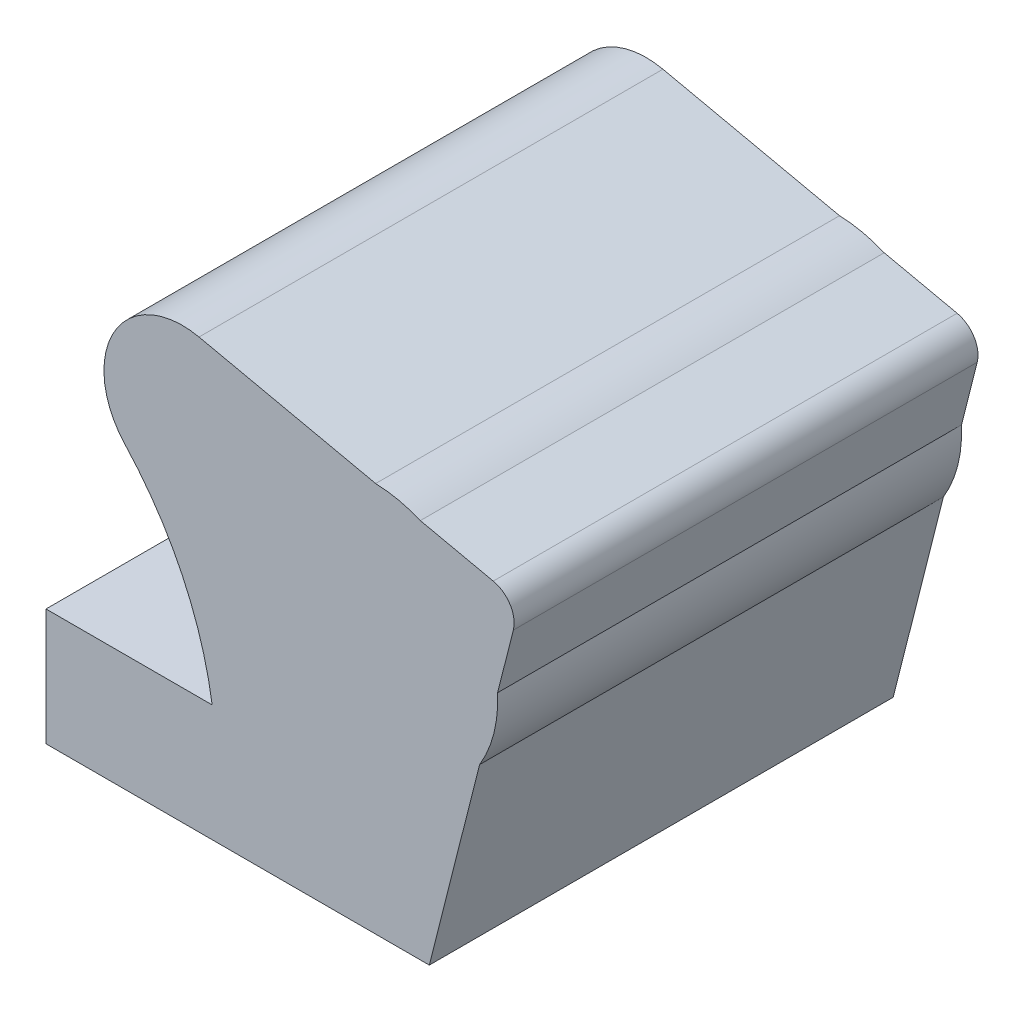
ISO-10303-21;
HEADER;
FILE_DESCRIPTION(('STEP AP214'),'2;1');
FILE_NAME('part.step','',(''),(''),'','','');
FILE_SCHEMA(('AUTOMOTIVE_DESIGN { 1 0 10303 214 1 1 1 1 }'));
ENDSEC;
DATA;
#1=APPLICATION_CONTEXT('core data for automotive mechanical design processes');
#2=APPLICATION_PROTOCOL_DEFINITION('international standard','automotive_design',2000,#1);
#3=PRODUCT_CONTEXT('',#1,'mechanical');
#4=PRODUCT('Part','Part','',(#3));
#5=PRODUCT_RELATED_PRODUCT_CATEGORY('part','',(#4));
#6=PRODUCT_DEFINITION_FORMATION('','',#4);
#7=PRODUCT_DEFINITION_CONTEXT('part definition',#1,'design');
#8=PRODUCT_DEFINITION('design','',#6,#7);
#9=PRODUCT_DEFINITION_SHAPE('','',#8);
#10=(LENGTH_UNIT() NAMED_UNIT(*) SI_UNIT(.MILLI.,.METRE.));
#11=(NAMED_UNIT(*) PLANE_ANGLE_UNIT() SI_UNIT($,.RADIAN.));
#12=(NAMED_UNIT(*) SI_UNIT($,.STERADIAN.) SOLID_ANGLE_UNIT());
#13=UNCERTAINTY_MEASURE_WITH_UNIT(LENGTH_MEASURE(1.E-05),#10,'distance_accuracy_value','');
#14=(GEOMETRIC_REPRESENTATION_CONTEXT(3) GLOBAL_UNCERTAINTY_ASSIGNED_CONTEXT((#13)) GLOBAL_UNIT_ASSIGNED_CONTEXT((#10,
#11,#12)) REPRESENTATION_CONTEXT('',''));
#15=CARTESIAN_POINT('',(0.,0.,0.));
#16=DIRECTION('',(0.,0.,1.));
#17=DIRECTION('',(1.,0.,0.));
#18=AXIS2_PLACEMENT_3D('',#15,#16,#17);
#19=CARTESIAN_POINT('',(18.9674720334947,63.3442468776892,50.));
#20=DIRECTION('',(0.,0.,-1.));
#21=DIRECTION('',(-1.,0.,0.));
#22=AXIS2_PLACEMENT_3D('',#19,#20,#21);
#23=CYLINDRICAL_SURFACE('',#22,74.3600000000827);
#24=CARTESIAN_POINT('',(18.9674720334947,63.3442468776892,-50.));
#25=DIRECTION('',(0.,0.,1.));
#26=DIRECTION('',(1.,0.,0.));
#27=AXIS2_PLACEMENT_3D('',#24,#25,#26);
#28=CIRCLE('',#27,74.3600000000827);
#29=CARTESIAN_POINT('',(92.4961728839557,74.4320668282345,-50.));
#30=VERTEX_POINT('',#29);
#31=CARTESIAN_POINT('',(73.6390675428682,113.746888122685,-50.));
#32=VERTEX_POINT('',#31);
#33=EDGE_CURVE('E181',#30,#32,#28,.T.);
#34=ORIENTED_EDGE('',*,*,#33,.F.);
#35=DIRECTION('',(0.,0.,-1.));
#36=VECTOR('',#35,1.);
#37=CARTESIAN_POINT('',(92.4961728839557,74.4320668282345,50.));
#38=LINE('',#37,#36);
#39=CARTESIAN_POINT('',(92.4961728839557,74.4320668282345,50.));
#40=VERTEX_POINT('',#39);
#41=EDGE_CURVE('E177',#40,#30,#38,.T.);
#42=ORIENTED_EDGE('',*,*,#41,.F.);
#43=CARTESIAN_POINT('',(18.9674720334947,63.3442468776892,50.));
#44=DIRECTION('',(0.,0.,1.));
#45=DIRECTION('',(1.,0.,0.));
#46=AXIS2_PLACEMENT_3D('',#43,#44,#45);
#47=CIRCLE('',#46,74.3600000000827);
#48=CARTESIAN_POINT('',(73.6390675428682,113.746888122685,50.));
#49=VERTEX_POINT('',#48);
#50=EDGE_CURVE('E179',#40,#49,#47,.T.);
#51=ORIENTED_EDGE('',*,*,#50,.T.);
#52=DIRECTION('',(0.,0.,-1.));
#53=VECTOR('',#52,1.);
#54=CARTESIAN_POINT('',(73.6390675428682,113.746888122685,50.));
#55=LINE('',#54,#53);
#56=EDGE_CURVE('E186',#49,#32,#55,.T.);
#57=ORIENTED_EDGE('',*,*,#56,.T.);
#58=EDGE_LOOP('',(#34,#42,#51,#57));
#59=FACE_BOUND('',#58,.T.);
#60=ADVANCED_FACE('F89',(#59),#23,.F.);
#61=CARTESIAN_POINT('',(86.0571495833515,125.195321778332,50.));
#62=DIRECTION('',(0.,0.,-1.));
#63=DIRECTION('',(-1.,0.,0.));
#64=AXIS2_PLACEMENT_3D('',#61,#62,#63);
#65=CYLINDRICAL_SURFACE('',#64,16.890097534707);
#66=CARTESIAN_POINT('',(86.0571495833515,125.195321778332,-50.));
#67=DIRECTION('',(0.,0.,-1.));
#68=DIRECTION('',(-1.,0.,0.));
#69=AXIS2_PLACEMENT_3D('',#66,#67,#68);
#70=CIRCLE('',#69,16.890097534707);
#71=CARTESIAN_POINT('',(89.6610000000004,141.696462857249,-50.));
#72=VERTEX_POINT('',#71);
#73=EDGE_CURVE('E223',#32,#72,#70,.T.);
#74=ORIENTED_EDGE('',*,*,#73,.F.);
#75=ORIENTED_EDGE('',*,*,#56,.F.);
#76=CARTESIAN_POINT('',(86.0571495833515,125.195321778332,50.));
#77=DIRECTION('',(0.,0.,-1.));
#78=DIRECTION('',(-1.,0.,0.));
#79=AXIS2_PLACEMENT_3D('',#76,#77,#78);
#80=CIRCLE('',#79,16.890097534707);
#81=CARTESIAN_POINT('',(89.6610000000004,141.696462857249,50.));
#82=VERTEX_POINT('',#81);
#83=EDGE_CURVE('E196',#49,#82,#80,.T.);
#84=ORIENTED_EDGE('',*,*,#83,.T.);
#85=DIRECTION('',(0.,0.,-1.));
#86=VECTOR('',#85,1.);
#87=CARTESIAN_POINT('',(89.6610000000004,141.696462857249,50.));
#88=LINE('',#87,#86);
#89=EDGE_CURVE('E248',#82,#72,#88,.T.);
#90=ORIENTED_EDGE('',*,*,#89,.T.);
#91=EDGE_LOOP('',(#74,#75,#84,#90));
#92=FACE_BOUND('',#91,.T.);
#93=ADVANCED_FACE('F294',(#92),#65,.T.);
#94=CARTESIAN_POINT('',(153.08647989012,127.844333417534,50.));
#95=DIRECTION('',(-0.213370610160388,-0.976971331575182,0.));
#96=DIRECTION('',(0.976971331575182,-0.213370610160388,0.));
#97=AXIS2_PLACEMENT_3D('',#94,#95,#96);
#98=PLANE('',#97);
#99=DIRECTION('',(0.,0.,-1.));
#100=VECTOR('',#99,1.);
#101=CARTESIAN_POINT('',(127.735239934011,133.381046075249,50.));
#102=LINE('',#101,#100);
#103=CARTESIAN_POINT('',(127.735239934011,133.381046075249,-50.));
#104=VERTEX_POINT('',#103);
#105=CARTESIAN_POINT('',(127.735239934011,133.381046075249,50.));
#106=VERTEX_POINT('',#105);
#107=EDGE_CURVE('E260',#104,#106,#102,.F.);
#108=ORIENTED_EDGE('',*,*,#107,.F.);
#109=DIRECTION('',(-0.976971331575182,0.213370610160388,0.));
#110=VECTOR('',#109,1.);
#111=CARTESIAN_POINT('',(153.08647989012,127.844333417534,-50.));
#112=LINE('',#111,#110);
#113=EDGE_CURVE('E226',#104,#72,#112,.T.);
#114=ORIENTED_EDGE('',*,*,#113,.T.);
#115=ORIENTED_EDGE('',*,*,#89,.F.);
#116=DIRECTION('',(-0.976971331575182,0.213370610160388,0.));
#117=VECTOR('',#116,1.);
#118=CARTESIAN_POINT('',(153.08647989012,127.844333417534,50.));
#119=LINE('',#118,#117);
#120=EDGE_CURVE('E207',#106,#82,#119,.T.);
#121=ORIENTED_EDGE('',*,*,#120,.F.);
#122=EDGE_LOOP('',(#108,#114,#115,#121));
#123=FACE_BOUND('',#122,.T.);
#124=ADVANCED_FACE('F290',(#123),#98,.F.);
#125=CARTESIAN_POINT('',(126.841000000001,106.1775,50.));
#126=DIRECTION('',(0.,0.,-1.));
#127=DIRECTION('',(-1.,0.,0.));
#128=AXIS2_PLACEMENT_3D('',#125,#126,#127);
#129=CYLINDRICAL_SURFACE('',#128,27.2182399160523);
#130=CARTESIAN_POINT('',(126.841000000001,106.1775,-50.));
#131=DIRECTION('',(0.,0.,1.));
#132=DIRECTION('',(1.,0.,0.));
#133=AXIS2_PLACEMENT_3D('',#130,#131,#132);
#134=CIRCLE('',#133,27.2182399160523);
#135=CARTESIAN_POINT('',(137.369721748575,131.27687454338,-50.));
#136=VERTEX_POINT('',#135);
#137=EDGE_CURVE('E255',#136,#104,#134,.T.);
#138=ORIENTED_EDGE('',*,*,#137,.T.);
#139=ORIENTED_EDGE('',*,*,#107,.T.);
#140=CARTESIAN_POINT('',(126.841000000001,106.1775,50.));
#141=DIRECTION('',(0.,0.,1.));
#142=DIRECTION('',(1.,0.,0.));
#143=AXIS2_PLACEMENT_3D('',#140,#141,#142);
#144=CIRCLE('',#143,27.2182399160523);
#145=CARTESIAN_POINT('',(137.369721748575,131.27687454338,50.));
#146=VERTEX_POINT('',#145);
#147=EDGE_CURVE('E221',#146,#106,#144,.T.);
#148=ORIENTED_EDGE('',*,*,#147,.F.);
#149=DIRECTION('',(0.,0.,-1.));
#150=VECTOR('',#149,1.);
#151=CARTESIAN_POINT('',(137.369721748575,131.27687454338,50.));
#152=LINE('',#151,#150);
#153=EDGE_CURVE('E238',#146,#136,#152,.T.);
#154=ORIENTED_EDGE('',*,*,#153,.T.);
#155=EDGE_LOOP('',(#138,#139,#148,#154));
#156=FACE_BOUND('',#155,.T.);
#157=ADVANCED_FACE('F287',(#156),#129,.T.);
#158=ORIENTED_EDGE('',*,*,#153,.F.);
#159=CARTESIAN_POINT('',(153.08647989012,127.844333417534,50.));
#160=VERTEX_POINT('',#159);
#161=EDGE_CURVE('E208',#160,#146,#119,.T.);
#162=ORIENTED_EDGE('',*,*,#161,.F.);
#163=DIRECTION('',(0.,0.,-1.));
#164=VECTOR('',#163,1.);
#165=CARTESIAN_POINT('',(153.08647989012,127.844333417534,50.));
#166=LINE('',#165,#164);
#167=CARTESIAN_POINT('',(153.08647989012,127.844333417534,-50.));
#168=VERTEX_POINT('',#167);
#169=EDGE_CURVE('E245',#160,#168,#166,.T.);
#170=ORIENTED_EDGE('',*,*,#169,.T.);
#171=EDGE_CURVE('E227',#168,#136,#112,.T.);
#172=ORIENTED_EDGE('',*,*,#171,.T.);
#173=EDGE_LOOP('',(#158,#162,#170,#172));
#174=FACE_BOUND('',#173,.T.);
#175=ADVANCED_FACE('F282',(#174),#98,.F.);
#176=CARTESIAN_POINT('',(151.866000000002,122.256057400924,50.));
#177=DIRECTION('',(0.,0.,-1.));
#178=DIRECTION('',(-1.,0.,0.));
#179=AXIS2_PLACEMENT_3D('',#176,#177,#178);
#180=CYLINDRICAL_SURFACE('',#179,5.72000000000003);
#181=CARTESIAN_POINT('',(151.866000000002,122.256057400924,-50.));
#182=DIRECTION('',(0.,0.,1.));
#183=DIRECTION('',(1.,0.,0.));
#184=AXIS2_PLACEMENT_3D('',#181,#182,#183);
#185=CIRCLE('',#184,5.72000000000003);
#186=CARTESIAN_POINT('',(157.411382405651,120.85351186686,-50.));
#187=VERTEX_POINT('',#186);
#188=EDGE_CURVE('E230',#187,#168,#185,.T.);
#189=ORIENTED_EDGE('',*,*,#188,.T.);
#190=ORIENTED_EDGE('',*,*,#169,.F.);
#191=CARTESIAN_POINT('',(151.866000000002,122.256057400924,50.));
#192=DIRECTION('',(0.,0.,1.));
#193=DIRECTION('',(1.,0.,0.));
#194=AXIS2_PLACEMENT_3D('',#191,#192,#193);
#195=CIRCLE('',#194,5.72000000000003);
#196=CARTESIAN_POINT('',(157.411382405651,120.85351186686,50.));
#197=VERTEX_POINT('',#196);
#198=EDGE_CURVE('E211',#197,#160,#195,.T.);
#199=ORIENTED_EDGE('',*,*,#198,.F.);
#200=DIRECTION('',(0.,0.,-1.));
#201=VECTOR('',#200,1.);
#202=CARTESIAN_POINT('',(157.411382405651,120.85351186686,50.));
#203=LINE('',#202,#201);
#204=EDGE_CURVE('E242',#197,#187,#203,.T.);
#205=ORIENTED_EDGE('',*,*,#204,.T.);
#206=EDGE_LOOP('',(#189,#190,#199,#205));
#207=FACE_BOUND('',#206,.T.);
#208=ADVANCED_FACE('F276',(#207),#180,.T.);
#209=CARTESIAN_POINT('',(139.303205184739,49.2574282315053,50.));
#210=DIRECTION('',(-0.969472448539981,0.24520026819295,0.));
#211=DIRECTION('',(-0.24520026819295,-0.969472448539981,0.));
#212=AXIS2_PLACEMENT_3D('',#209,#210,#211);
#213=PLANE('',#212);
#214=DIRECTION('',(0.,0.,-1.));
#215=VECTOR('',#214,1.);
#216=CARTESIAN_POINT('',(154.028196984966,107.477078481087,50.));
#217=LINE('',#216,#215);
#218=CARTESIAN_POINT('',(154.028196984966,107.477078481087,-50.));
#219=VERTEX_POINT('',#218);
#220=CARTESIAN_POINT('',(154.028196984966,107.477078481087,50.));
#221=VERTEX_POINT('',#220);
#222=EDGE_CURVE('E97',#219,#221,#217,.F.);
#223=ORIENTED_EDGE('',*,*,#222,.F.);
#224=DIRECTION('',(0.24520026819295,0.96947244853998,0.));
#225=VECTOR('',#224,1.);
#226=CARTESIAN_POINT('',(139.303205184739,49.2574282315053,-50.));
#227=LINE('',#226,#225);
#228=EDGE_CURVE('E232',#219,#187,#227,.T.);
#229=ORIENTED_EDGE('',*,*,#228,.T.);
#230=ORIENTED_EDGE('',*,*,#204,.F.);
#231=DIRECTION('',(0.24520026819295,0.96947244853998,0.));
#232=VECTOR('',#231,1.);
#233=CARTESIAN_POINT('',(139.303205184739,49.2574282315053,50.));
#234=LINE('',#233,#232);
#235=EDGE_CURVE('E213',#221,#197,#234,.T.);
#236=ORIENTED_EDGE('',*,*,#235,.F.);
#237=EDGE_LOOP('',(#223,#229,#230,#236));
#238=FACE_BOUND('',#237,.T.);
#239=ADVANCED_FACE('F271',(#238),#213,.F.);
#240=CARTESIAN_POINT('',(150.141177621161,92.1085872150625,-50.));
#241=VERTEX_POINT('',#240);
#242=EDGE_CURVE('E256',#241,#219,#134,.T.);
#243=ORIENTED_EDGE('',*,*,#242,.T.);
#244=ORIENTED_EDGE('',*,*,#222,.T.);
#245=CARTESIAN_POINT('',(150.141177621161,92.1085872150625,50.));
#246=VERTEX_POINT('',#245);
#247=EDGE_CURVE('E252',#246,#221,#144,.T.);
#248=ORIENTED_EDGE('',*,*,#247,.F.);
#249=DIRECTION('',(0.,0.,-1.));
#250=VECTOR('',#249,1.);
#251=CARTESIAN_POINT('',(150.141177621161,92.1085872150625,50.));
#252=LINE('',#251,#250);
#253=EDGE_CURVE('E262',#246,#241,#252,.T.);
#254=ORIENTED_EDGE('',*,*,#253,.T.);
#255=EDGE_LOOP('',(#243,#244,#248,#254));
#256=FACE_BOUND('',#255,.T.);
#257=ADVANCED_FACE('F91',(#256),#129,.T.);
#258=CARTESIAN_POINT('',(56.6720409296533,74.4320668282345,50.));
#259=DIRECTION('',(0.,1.,0.));
#260=DIRECTION('',(0.,0.,1.));
#261=AXIS2_PLACEMENT_3D('',#258,#259,#260);
#262=PLANE('',#261);
#263=DIRECTION('',(1.,0.,0.));
#264=VECTOR('',#263,1.);
#265=CARTESIAN_POINT('',(56.6720409296533,74.4320668282345,-50.));
#266=LINE('',#265,#264);
#267=CARTESIAN_POINT('',(56.6720409296533,74.4320668282345,-50.));
#268=VERTEX_POINT('',#267);
#269=EDGE_CURVE('E219',#268,#30,#266,.T.);
#270=ORIENTED_EDGE('',*,*,#269,.F.);
#271=DIRECTION('',(0.,0.,-1.));
#272=VECTOR('',#271,1.);
#273=CARTESIAN_POINT('',(56.6720409296533,74.4320668282345,50.));
#274=LINE('',#273,#272);
#275=CARTESIAN_POINT('',(56.6720409296533,74.4320668282345,50.));
#276=VERTEX_POINT('',#275);
#277=EDGE_CURVE('E201',#276,#268,#274,.T.);
#278=ORIENTED_EDGE('',*,*,#277,.F.);
#279=DIRECTION('',(1.,0.,0.));
#280=VECTOR('',#279,1.);
#281=CARTESIAN_POINT('',(56.6720409296533,74.4320668282345,50.));
#282=LINE('',#281,#280);
#283=EDGE_CURVE('E194',#276,#40,#282,.T.);
#284=ORIENTED_EDGE('',*,*,#283,.T.);
#285=ORIENTED_EDGE('',*,*,#41,.T.);
#286=EDGE_LOOP('',(#270,#278,#284,#285));
#287=FACE_BOUND('',#286,.T.);
#288=ADVANCED_FACE('F199',(#287),#262,.T.);
#289=CARTESIAN_POINT('',(18.9674720334947,63.3442468776892,50.));
#290=DIRECTION('',(0.,0.,1.));
#291=DIRECTION('',(1.,0.,0.));
#292=AXIS2_PLACEMENT_3D('',#289,#290,#291);
#293=PLANE('',#292);
#294=DIRECTION('',(0.,1.,0.));
#295=VECTOR('',#294,1.);
#296=CARTESIAN_POINT('',(56.6720409296533,43.5041088750114,50.));
#297=LINE('',#296,#295);
#298=CARTESIAN_POINT('',(56.6720409296533,49.2574282315053,50.));
#299=VERTEX_POINT('',#298);
#300=EDGE_CURVE('E187',#299,#276,#297,.T.);
#301=ORIENTED_EDGE('',*,*,#300,.F.);
#302=DIRECTION('',(1.,0.,0.));
#303=VECTOR('',#302,1.);
#304=CARTESIAN_POINT('',(123.35351613374,49.2574282315053,50.));
#305=LINE('',#304,#303);
#306=CARTESIAN_POINT('',(139.303205184739,49.2574282315053,50.));
#307=VERTEX_POINT('',#306);
#308=EDGE_CURVE('E110',#299,#307,#305,.T.);
#309=ORIENTED_EDGE('',*,*,#308,.T.);
#310=EDGE_CURVE('E214',#307,#246,#234,.T.);
#311=ORIENTED_EDGE('',*,*,#310,.T.);
#312=ORIENTED_EDGE('',*,*,#247,.T.);
#313=ORIENTED_EDGE('',*,*,#235,.T.);
#314=ORIENTED_EDGE('',*,*,#198,.T.);
#315=ORIENTED_EDGE('',*,*,#161,.T.);
#316=ORIENTED_EDGE('',*,*,#147,.T.);
#317=ORIENTED_EDGE('',*,*,#120,.T.);
#318=ORIENTED_EDGE('',*,*,#83,.F.);
#319=ORIENTED_EDGE('',*,*,#50,.F.);
#320=ORIENTED_EDGE('',*,*,#283,.F.);
#321=EDGE_LOOP('',(#301,#309,#311,#312,#313,#314,#315,#316,#317,#318,#319,#320));
#322=FACE_BOUND('',#321,.T.);
#323=ADVANCED_FACE('F193',(#322),#293,.T.);
#324=ORIENTED_EDGE('',*,*,#253,.F.);
#325=ORIENTED_EDGE('',*,*,#310,.F.);
#326=DIRECTION('',(0.,0.,-1.));
#327=VECTOR('',#326,1.);
#328=CARTESIAN_POINT('',(139.303205184739,49.2574282315053,50.));
#329=LINE('',#328,#327);
#330=CARTESIAN_POINT('',(139.303205184739,49.2574282315053,-50.));
#331=VERTEX_POINT('',#330);
#332=EDGE_CURVE('E239',#307,#331,#329,.T.);
#333=ORIENTED_EDGE('',*,*,#332,.T.);
#334=EDGE_CURVE('E233',#331,#241,#227,.T.);
#335=ORIENTED_EDGE('',*,*,#334,.T.);
#336=EDGE_LOOP('',(#324,#325,#333,#335));
#337=FACE_BOUND('',#336,.T.);
#338=ADVANCED_FACE('F301',(#337),#213,.F.);
#339=CARTESIAN_POINT('',(18.9674720334947,63.3442468776892,-50.));
#340=DIRECTION('',(0.,0.,1.));
#341=DIRECTION('',(1.,0.,0.));
#342=AXIS2_PLACEMENT_3D('',#339,#340,#341);
#343=PLANE('',#342);
#344=DIRECTION('',(1.,0.,0.));
#345=VECTOR('',#344,1.);
#346=CARTESIAN_POINT('',(123.35351613374,49.2574282315053,-50.));
#347=LINE('',#346,#345);
#348=CARTESIAN_POINT('',(56.6720409296533,49.2574282315053,-50.));
#349=VERTEX_POINT('',#348);
#350=EDGE_CURVE('E104',#349,#331,#347,.T.);
#351=ORIENTED_EDGE('',*,*,#350,.F.);
#352=DIRECTION('',(0.,1.,0.));
#353=VECTOR('',#352,1.);
#354=CARTESIAN_POINT('',(56.6720409296533,43.5041088750114,-50.));
#355=LINE('',#354,#353);
#356=EDGE_CURVE('E202',#349,#268,#355,.T.);
#357=ORIENTED_EDGE('',*,*,#356,.T.);
#358=ORIENTED_EDGE('',*,*,#269,.T.);
#359=ORIENTED_EDGE('',*,*,#33,.T.);
#360=ORIENTED_EDGE('',*,*,#73,.T.);
#361=ORIENTED_EDGE('',*,*,#113,.F.);
#362=ORIENTED_EDGE('',*,*,#137,.F.);
#363=ORIENTED_EDGE('',*,*,#171,.F.);
#364=ORIENTED_EDGE('',*,*,#188,.F.);
#365=ORIENTED_EDGE('',*,*,#228,.F.);
#366=ORIENTED_EDGE('',*,*,#242,.F.);
#367=ORIENTED_EDGE('',*,*,#334,.F.);
#368=EDGE_LOOP('',(#351,#357,#358,#359,#360,#361,#362,#363,#364,#365,#366,#367));
#369=FACE_BOUND('',#368,.T.);
#370=ADVANCED_FACE('F295',(#369),#343,.F.);
#371=CARTESIAN_POINT('',(123.35351613374,49.2574282315053,50.));
#372=DIRECTION('',(0.,1.,0.));
#373=DIRECTION('',(-1.,0.,0.));
#374=AXIS2_PLACEMENT_3D('',#371,#372,#373);
#375=PLANE('',#374);
#376=ORIENTED_EDGE('',*,*,#350,.T.);
#377=ORIENTED_EDGE('',*,*,#332,.F.);
#378=ORIENTED_EDGE('',*,*,#308,.F.);
#379=DIRECTION('',(0.,0.,-1.));
#380=VECTOR('',#379,1.);
#381=CARTESIAN_POINT('',(56.6720409296533,49.2574282315053,50.));
#382=LINE('',#381,#380);
#383=EDGE_CURVE('E12',#299,#349,#382,.T.);
#384=ORIENTED_EDGE('',*,*,#383,.T.);
#385=EDGE_LOOP('',(#376,#377,#378,#384));
#386=FACE_BOUND('',#385,.T.);
#387=ADVANCED_FACE('F299',(#386),#375,.F.);
#388=CARTESIAN_POINT('',(56.6720409296533,43.5041088750114,50.));
#389=DIRECTION('',(-1.,0.,0.));
#390=DIRECTION('',(0.,-1.,0.));
#391=AXIS2_PLACEMENT_3D('',#388,#389,#390);
#392=PLANE('',#391);
#393=ORIENTED_EDGE('',*,*,#383,.F.);
#394=ORIENTED_EDGE('',*,*,#300,.T.);
#395=ORIENTED_EDGE('',*,*,#277,.T.);
#396=ORIENTED_EDGE('',*,*,#356,.F.);
#397=EDGE_LOOP('',(#393,#394,#395,#396));
#398=FACE_BOUND('',#397,.T.);
#399=ADVANCED_FACE('F298',(#398),#392,.T.);
#400=CLOSED_SHELL('',(#60,#93,#124,#157,#175,#208,#239,#257,#288,#323,#338,#370,#387,#399));
#401=MANIFOLD_SOLID_BREP('B2',#400);
#402=ADVANCED_BREP_SHAPE_REPRESENTATION('',(#18,#401),#14);
#403=SHAPE_DEFINITION_REPRESENTATION(#9,#402);
ENDSEC;
END-ISO-10303-21;
